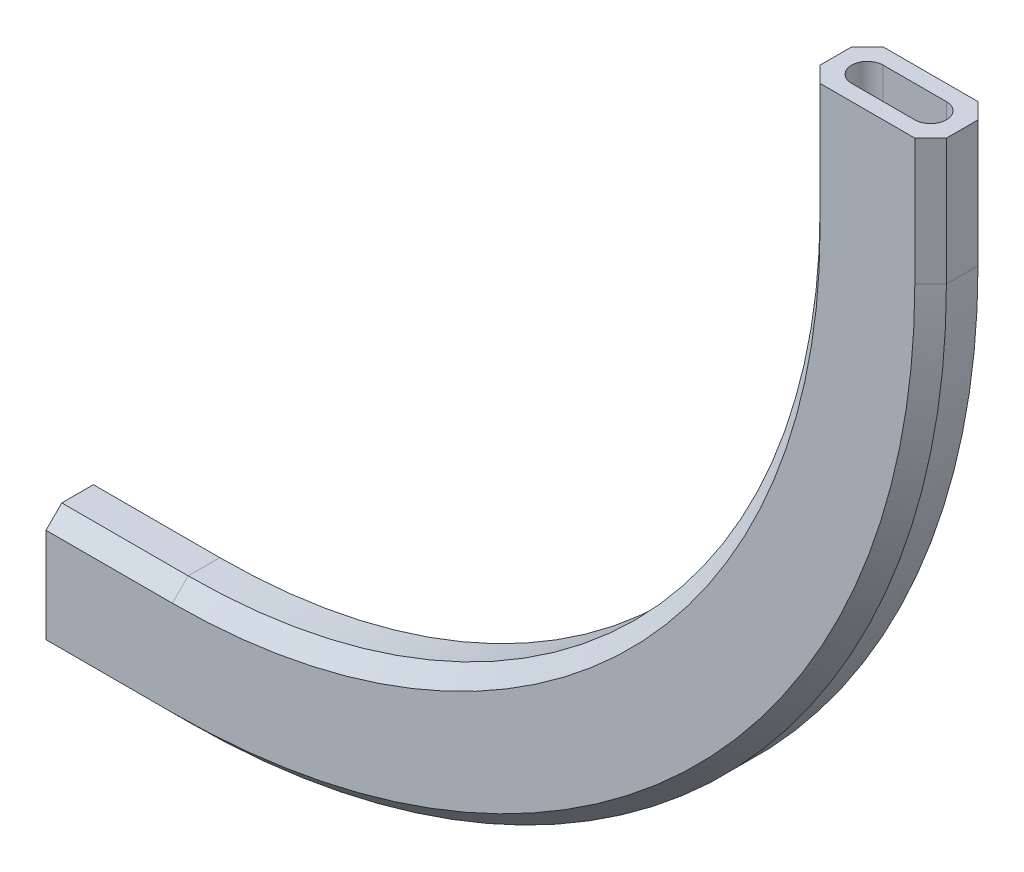
ISO-10303-21;
HEADER;
FILE_DESCRIPTION(('STEP AP214'),'2;1');
FILE_NAME('part.step','',(''),(''),'','','');
FILE_SCHEMA(('AUTOMOTIVE_DESIGN { 1 0 10303 214 1 1 1 1 }'));
ENDSEC;
DATA;
#1=APPLICATION_CONTEXT('core data for automotive mechanical design processes');
#2=APPLICATION_PROTOCOL_DEFINITION('international standard','automotive_design',2000,#1);
#3=PRODUCT_CONTEXT('',#1,'mechanical');
#4=PRODUCT('Part','Part','',(#3));
#5=PRODUCT_RELATED_PRODUCT_CATEGORY('part','',(#4));
#6=PRODUCT_DEFINITION_FORMATION('','',#4);
#7=PRODUCT_DEFINITION_CONTEXT('part definition',#1,'design');
#8=PRODUCT_DEFINITION('design','',#6,#7);
#9=PRODUCT_DEFINITION_SHAPE('','',#8);
#10=(LENGTH_UNIT() NAMED_UNIT(*) SI_UNIT(.MILLI.,.METRE.));
#11=(NAMED_UNIT(*) PLANE_ANGLE_UNIT() SI_UNIT($,.RADIAN.));
#12=(NAMED_UNIT(*) SI_UNIT($,.STERADIAN.) SOLID_ANGLE_UNIT());
#13=UNCERTAINTY_MEASURE_WITH_UNIT(LENGTH_MEASURE(1.E-05),#10,'distance_accuracy_value','');
#14=(GEOMETRIC_REPRESENTATION_CONTEXT(3) GLOBAL_UNCERTAINTY_ASSIGNED_CONTEXT((#13)) GLOBAL_UNIT_ASSIGNED_CONTEXT((#10,
#11,#12)) REPRESENTATION_CONTEXT('',''));
#15=CARTESIAN_POINT('',(0.,0.,0.));
#16=DIRECTION('',(0.,0.,1.));
#17=DIRECTION('',(1.,0.,0.));
#18=AXIS2_PLACEMENT_3D('',#15,#16,#17);
#19=CARTESIAN_POINT('',(0.,0.,6.35));
#20=DIRECTION('',(1.,0.,0.));
#21=DIRECTION('',(0.,0.,-1.));
#22=AXIS2_PLACEMENT_3D('',#19,#20,#21);
#23=PLANE('',#22);
#24=DIRECTION('',(0.,-1.,0.));
#25=VECTOR('',#24,1.);
#26=CARTESIAN_POINT('',(0.,-3.175,1.5875));
#27=LINE('',#26,#25);
#28=CARTESIAN_POINT('',(0.,-3.175,1.5875));
#29=VERTEX_POINT('',#28);
#30=CARTESIAN_POINT('',(0.,-9.525,1.5875));
#31=VERTEX_POINT('',#30);
#32=EDGE_CURVE('E231',#29,#31,#27,.T.);
#33=ORIENTED_EDGE('',*,*,#32,.F.);
#34=CARTESIAN_POINT('',(0.,-3.175,3.175));
#35=DIRECTION('',(-1.,0.,0.));
#36=DIRECTION('',(0.,0.,1.));
#37=AXIS2_PLACEMENT_3D('',#34,#35,#36);
#38=CIRCLE('',#37,1.5875);
#39=CARTESIAN_POINT('',(0.,-3.175,4.7625));
#40=VERTEX_POINT('',#39);
#41=EDGE_CURVE('E205',#40,#29,#38,.T.);
#42=ORIENTED_EDGE('',*,*,#41,.F.);
#43=DIRECTION('',(0.,1.,0.));
#44=VECTOR('',#43,1.);
#45=CARTESIAN_POINT('',(0.,-3.175,4.7625));
#46=LINE('',#45,#44);
#47=CARTESIAN_POINT('',(0.,-9.525,4.7625));
#48=VERTEX_POINT('',#47);
#49=EDGE_CURVE('E222',#48,#40,#46,.T.);
#50=ORIENTED_EDGE('',*,*,#49,.F.);
#51=CARTESIAN_POINT('',(0.,-9.525,3.175));
#52=DIRECTION('',(-1.,0.,0.));
#53=DIRECTION('',(0.,0.,1.));
#54=AXIS2_PLACEMENT_3D('',#51,#52,#53);
#55=CIRCLE('',#54,1.5875);
#56=EDGE_CURVE('E225',#31,#48,#55,.T.);
#57=ORIENTED_EDGE('',*,*,#56,.F.);
#58=EDGE_LOOP('',(#33,#42,#50,#57));
#59=FACE_BOUND('',#58,.T.);
#60=DIRECTION('',(0.,-1.,0.));
#61=VECTOR('',#60,1.);
#62=CARTESIAN_POINT('',(0.,0.,0.));
#63=LINE('',#62,#61);
#64=CARTESIAN_POINT('',(0.,-1.58749999999999,0.));
#65=VERTEX_POINT('',#64);
#66=CARTESIAN_POINT('',(0.,-11.1125,0.));
#67=VERTEX_POINT('',#66);
#68=EDGE_CURVE('E267',#65,#67,#63,.T.);
#69=ORIENTED_EDGE('',*,*,#68,.T.);
#70=DIRECTION('',(0.,-0.707106781186547,0.707106781186548));
#71=VECTOR('',#70,1.);
#72=CARTESIAN_POINT('',(0.,-12.7,1.58749999999998));
#73=LINE('',#72,#71);
#74=CARTESIAN_POINT('',(0.,-12.7,1.58749999999998));
#75=VERTEX_POINT('',#74);
#76=EDGE_CURVE('E330',#67,#75,#73,.T.);
#77=ORIENTED_EDGE('',*,*,#76,.T.);
#78=DIRECTION('',(0.,0.,-1.));
#79=VECTOR('',#78,1.);
#80=CARTESIAN_POINT('',(0.,-12.7,6.35));
#81=LINE('',#80,#79);
#82=CARTESIAN_POINT('',(0.,-12.7,4.76250000000001));
#83=VERTEX_POINT('',#82);
#84=EDGE_CURVE('E304',#83,#75,#81,.T.);
#85=ORIENTED_EDGE('',*,*,#84,.F.);
#86=DIRECTION('',(0.,-0.707106781186547,-0.707106781186548));
#87=VECTOR('',#86,1.);
#88=CARTESIAN_POINT('',(0.,-11.1125,6.35));
#89=LINE('',#88,#87);
#90=CARTESIAN_POINT('',(0.,-11.1125,6.35));
#91=VERTEX_POINT('',#90);
#92=EDGE_CURVE('E328',#83,#91,#89,.F.);
#93=ORIENTED_EDGE('',*,*,#92,.T.);
#94=DIRECTION('',(0.,-1.,0.));
#95=VECTOR('',#94,1.);
#96=CARTESIAN_POINT('',(0.,0.,6.35));
#97=LINE('',#96,#95);
#98=CARTESIAN_POINT('',(0.,-1.58750000000001,6.35));
#99=VERTEX_POINT('',#98);
#100=EDGE_CURVE('E274',#99,#91,#97,.T.);
#101=ORIENTED_EDGE('',*,*,#100,.F.);
#102=DIRECTION('',(0.,-0.707106781186551,0.707106781186544));
#103=VECTOR('',#102,1.);
#104=CARTESIAN_POINT('',(0.,-1.58750000000001,6.35));
#105=LINE('',#104,#103);
#106=CARTESIAN_POINT('',(0.,0.,4.76250000000001));
#107=VERTEX_POINT('',#106);
#108=EDGE_CURVE('E324',#99,#107,#105,.F.);
#109=ORIENTED_EDGE('',*,*,#108,.T.);
#110=DIRECTION('',(0.,0.,-1.));
#111=VECTOR('',#110,1.);
#112=CARTESIAN_POINT('',(0.,0.,6.35));
#113=LINE('',#112,#111);
#114=CARTESIAN_POINT('',(0.,0.,1.58749999999998));
#115=VERTEX_POINT('',#114);
#116=EDGE_CURVE('E281',#107,#115,#113,.T.);
#117=ORIENTED_EDGE('',*,*,#116,.T.);
#118=DIRECTION('',(0.,-0.707106781186551,-0.707106781186544));
#119=VECTOR('',#118,1.);
#120=CARTESIAN_POINT('',(0.,0.,1.58749999999998));
#121=LINE('',#120,#119);
#122=EDGE_CURVE('E326',#115,#65,#121,.T.);
#123=ORIENTED_EDGE('',*,*,#122,.T.);
#124=EDGE_LOOP('',(#69,#77,#85,#93,#101,#109,#117,#123));
#125=FACE_BOUND('',#124,.T.);
#126=ADVANCED_FACE('F35',(#59,#125),#23,.F.);
#127=CARTESIAN_POINT('',(0.,-12.7,6.35));
#128=DIRECTION('',(0.,1.,0.));
#129=DIRECTION('',(0.,0.,1.));
#130=AXIS2_PLACEMENT_3D('',#127,#128,#129);
#131=PLANE('',#130);
#132=ORIENTED_EDGE('',*,*,#84,.T.);
#133=DIRECTION('',(1.,0.,0.));
#134=VECTOR('',#133,1.);
#135=CARTESIAN_POINT('',(12.7,-12.7,1.58749999999998));
#136=LINE('',#135,#134);
#137=CARTESIAN_POINT('',(12.7,-12.7,1.58749999999998));
#138=VERTEX_POINT('',#137);
#139=EDGE_CURVE('E309',#75,#138,#136,.T.);
#140=ORIENTED_EDGE('',*,*,#139,.T.);
#141=DIRECTION('',(0.,0.,-1.));
#142=VECTOR('',#141,1.);
#143=CARTESIAN_POINT('',(12.7,-12.7,6.35));
#144=LINE('',#143,#142);
#145=CARTESIAN_POINT('',(12.7,-12.7,4.76250000000001));
#146=VERTEX_POINT('',#145);
#147=EDGE_CURVE('E301',#146,#138,#144,.T.);
#148=ORIENTED_EDGE('',*,*,#147,.F.);
#149=DIRECTION('',(-1.,0.,0.));
#150=VECTOR('',#149,1.);
#151=CARTESIAN_POINT('',(0.,-12.7,4.76250000000001));
#152=LINE('',#151,#150);
#153=EDGE_CURVE('E307',#146,#83,#152,.T.);
#154=ORIENTED_EDGE('',*,*,#153,.T.);
#155=EDGE_LOOP('',(#132,#140,#148,#154));
#156=FACE_BOUND('',#155,.T.);
#157=ADVANCED_FACE('F425',(#156),#131,.F.);
#158=CARTESIAN_POINT('',(12.7,63.5,6.35));
#159=DIRECTION('',(0.,0.,-1.));
#160=DIRECTION('',(-1.,0.,0.));
#161=AXIS2_PLACEMENT_3D('',#158,#159,#160);
#162=CYLINDRICAL_SURFACE('',#161,76.2);
#163=ORIENTED_EDGE('',*,*,#147,.T.);
#164=CARTESIAN_POINT('',(12.7,63.5,1.58749999999998));
#165=DIRECTION('',(0.,0.,-1.));
#166=DIRECTION('',(-1.,0.,0.));
#167=AXIS2_PLACEMENT_3D('',#164,#165,#166);
#168=CIRCLE('',#167,76.2);
#169=CARTESIAN_POINT('',(88.9,63.5,1.58749999999998));
#170=VERTEX_POINT('',#169);
#171=EDGE_CURVE('E346',#138,#170,#168,.F.);
#172=ORIENTED_EDGE('',*,*,#171,.T.);
#173=DIRECTION('',(0.,0.,-1.));
#174=VECTOR('',#173,1.);
#175=CARTESIAN_POINT('',(88.9,63.5,6.35));
#176=LINE('',#175,#174);
#177=CARTESIAN_POINT('',(88.9,63.5,4.76250000000001));
#178=VERTEX_POINT('',#177);
#179=EDGE_CURVE('E298',#178,#170,#176,.T.);
#180=ORIENTED_EDGE('',*,*,#179,.F.);
#181=CARTESIAN_POINT('',(12.7,63.5,4.76250000000001));
#182=DIRECTION('',(0.,0.,-1.));
#183=DIRECTION('',(-1.,0.,0.));
#184=AXIS2_PLACEMENT_3D('',#181,#182,#183);
#185=CIRCLE('',#184,76.2);
#186=EDGE_CURVE('E344',#178,#146,#185,.T.);
#187=ORIENTED_EDGE('',*,*,#186,.T.);
#188=EDGE_LOOP('',(#163,#172,#180,#187));
#189=FACE_BOUND('',#188,.T.);
#190=ADVANCED_FACE('F423',(#189),#162,.T.);
#191=CARTESIAN_POINT('',(88.9,63.5,6.35));
#192=DIRECTION('',(-1.,0.,0.));
#193=DIRECTION('',(0.,0.,1.));
#194=AXIS2_PLACEMENT_3D('',#191,#192,#193);
#195=PLANE('',#194);
#196=ORIENTED_EDGE('',*,*,#179,.T.);
#197=DIRECTION('',(0.,1.,0.));
#198=VECTOR('',#197,1.);
#199=CARTESIAN_POINT('',(88.9,76.2,1.58749999999998));
#200=LINE('',#199,#198);
#201=CARTESIAN_POINT('',(88.9,76.2,1.58749999999998));
#202=VERTEX_POINT('',#201);
#203=EDGE_CURVE('E334',#170,#202,#200,.T.);
#204=ORIENTED_EDGE('',*,*,#203,.T.);
#205=DIRECTION('',(0.,0.,-1.));
#206=VECTOR('',#205,1.);
#207=CARTESIAN_POINT('',(88.9,76.2,6.35));
#208=LINE('',#207,#206);
#209=CARTESIAN_POINT('',(88.9,76.2,4.76250000000001));
#210=VERTEX_POINT('',#209);
#211=EDGE_CURVE('E295',#210,#202,#208,.T.);
#212=ORIENTED_EDGE('',*,*,#211,.F.);
#213=DIRECTION('',(0.,-1.,0.));
#214=VECTOR('',#213,1.);
#215=CARTESIAN_POINT('',(88.9,63.5,4.76250000000001));
#216=LINE('',#215,#214);
#217=EDGE_CURVE('E332',#210,#178,#216,.T.);
#218=ORIENTED_EDGE('',*,*,#217,.T.);
#219=EDGE_LOOP('',(#196,#204,#212,#218));
#220=FACE_BOUND('',#219,.T.);
#221=ADVANCED_FACE('F439',(#220),#195,.F.);
#222=CARTESIAN_POINT('',(76.2,76.2,6.35));
#223=DIRECTION('',(0.,-1.,0.));
#224=DIRECTION('',(0.,0.,-1.));
#225=AXIS2_PLACEMENT_3D('',#222,#223,#224);
#226=PLANE('',#225);
#227=DIRECTION('',(1.,0.,0.));
#228=VECTOR('',#227,1.);
#229=CARTESIAN_POINT('',(79.375,76.2,4.7625));
#230=LINE('',#229,#228);
#231=CARTESIAN_POINT('',(79.375,76.2,4.7625));
#232=VERTEX_POINT('',#231);
#233=CARTESIAN_POINT('',(85.725,76.2,4.7625));
#234=VERTEX_POINT('',#233);
#235=EDGE_CURVE('E257',#232,#234,#230,.T.);
#236=ORIENTED_EDGE('',*,*,#235,.F.);
#237=CARTESIAN_POINT('',(79.375,76.2,3.175));
#238=DIRECTION('',(0.,1.,0.));
#239=DIRECTION('',(0.,0.,1.));
#240=AXIS2_PLACEMENT_3D('',#237,#238,#239);
#241=CIRCLE('',#240,1.5875);
#242=CARTESIAN_POINT('',(79.375,76.2,1.5875));
#243=VERTEX_POINT('',#242);
#244=EDGE_CURVE('E238',#243,#232,#241,.T.);
#245=ORIENTED_EDGE('',*,*,#244,.F.);
#246=DIRECTION('',(-1.,0.,0.));
#247=VECTOR('',#246,1.);
#248=CARTESIAN_POINT('',(79.375,76.2,1.5875));
#249=LINE('',#248,#247);
#250=CARTESIAN_POINT('',(85.725,76.2,1.5875));
#251=VERTEX_POINT('',#250);
#252=EDGE_CURVE('E246',#251,#243,#249,.T.);
#253=ORIENTED_EDGE('',*,*,#252,.F.);
#254=CARTESIAN_POINT('',(85.725,76.2,3.175));
#255=DIRECTION('',(0.,1.,0.));
#256=DIRECTION('',(0.,0.,1.));
#257=AXIS2_PLACEMENT_3D('',#254,#255,#256);
#258=CIRCLE('',#257,1.5875);
#259=EDGE_CURVE('E260',#234,#251,#258,.T.);
#260=ORIENTED_EDGE('',*,*,#259,.F.);
#261=EDGE_LOOP('',(#236,#245,#253,#260));
#262=FACE_BOUND('',#261,.T.);
#263=ORIENTED_EDGE('',*,*,#211,.T.);
#264=DIRECTION('',(-0.707106781186548,0.,-0.707106781186548));
#265=VECTOR('',#264,1.);
#266=CARTESIAN_POINT('',(88.9,76.2,1.58749999999998));
#267=LINE('',#266,#265);
#268=CARTESIAN_POINT('',(87.3125,76.2,0.));
#269=VERTEX_POINT('',#268);
#270=EDGE_CURVE('E342',#202,#269,#267,.T.);
#271=ORIENTED_EDGE('',*,*,#270,.T.);
#272=DIRECTION('',(-1.,0.,0.));
#273=VECTOR('',#272,1.);
#274=CARTESIAN_POINT('',(76.2,76.2,0.));
#275=LINE('',#274,#273);
#276=CARTESIAN_POINT('',(77.7875,76.2,0.));
#277=VERTEX_POINT('',#276);
#278=EDGE_CURVE('E278',#269,#277,#275,.T.);
#279=ORIENTED_EDGE('',*,*,#278,.T.);
#280=DIRECTION('',(-0.707106781186551,0.,0.707106781186544));
#281=VECTOR('',#280,1.);
#282=CARTESIAN_POINT('',(76.2,76.2,1.58749999999997));
#283=LINE('',#282,#281);
#284=CARTESIAN_POINT('',(76.2,76.2,1.58749999999999));
#285=VERTEX_POINT('',#284);
#286=EDGE_CURVE('E338',#277,#285,#283,.T.);
#287=ORIENTED_EDGE('',*,*,#286,.T.);
#288=DIRECTION('',(0.,0.,-1.));
#289=VECTOR('',#288,1.);
#290=CARTESIAN_POINT('',(76.2,76.2,6.35));
#291=LINE('',#290,#289);
#292=CARTESIAN_POINT('',(76.2,76.2,4.7625));
#293=VERTEX_POINT('',#292);
#294=EDGE_CURVE('E292',#293,#285,#291,.T.);
#295=ORIENTED_EDGE('',*,*,#294,.F.);
#296=DIRECTION('',(-0.707106781186551,0.,-0.707106781186544));
#297=VECTOR('',#296,1.);
#298=CARTESIAN_POINT('',(77.7875,76.2,6.35000000000001));
#299=LINE('',#298,#297);
#300=CARTESIAN_POINT('',(77.7875,76.2,6.35));
#301=VERTEX_POINT('',#300);
#302=EDGE_CURVE('E336',#293,#301,#299,.F.);
#303=ORIENTED_EDGE('',*,*,#302,.T.);
#304=DIRECTION('',(-1.,0.,0.));
#305=VECTOR('',#304,1.);
#306=CARTESIAN_POINT('',(76.2,76.2,6.35));
#307=LINE('',#306,#305);
#308=CARTESIAN_POINT('',(87.3125,76.2,6.35));
#309=VERTEX_POINT('',#308);
#310=EDGE_CURVE('E277',#309,#301,#307,.T.);
#311=ORIENTED_EDGE('',*,*,#310,.F.);
#312=DIRECTION('',(-0.707106781186548,0.,0.707106781186548));
#313=VECTOR('',#312,1.);
#314=CARTESIAN_POINT('',(87.3125,76.2,6.35));
#315=LINE('',#314,#313);
#316=EDGE_CURVE('E340',#309,#210,#315,.F.);
#317=ORIENTED_EDGE('',*,*,#316,.T.);
#318=EDGE_LOOP('',(#263,#271,#279,#287,#295,#303,#311,#317));
#319=FACE_BOUND('',#318,.T.);
#320=ADVANCED_FACE('F447',(#262,#319),#226,.F.);
#321=CARTESIAN_POINT('',(76.2,63.5,6.35));
#322=DIRECTION('',(1.,0.,0.));
#323=DIRECTION('',(0.,1.,0.));
#324=AXIS2_PLACEMENT_3D('',#321,#322,#323);
#325=PLANE('',#324);
#326=ORIENTED_EDGE('',*,*,#294,.T.);
#327=DIRECTION('',(0.,-1.,0.));
#328=VECTOR('',#327,1.);
#329=CARTESIAN_POINT('',(76.2,63.5,1.58749999999998));
#330=LINE('',#329,#328);
#331=CARTESIAN_POINT('',(76.2,63.5,1.58749999999998));
#332=VERTEX_POINT('',#331);
#333=EDGE_CURVE('E364',#285,#332,#330,.T.);
#334=ORIENTED_EDGE('',*,*,#333,.T.);
#335=DIRECTION('',(0.,0.,-1.));
#336=VECTOR('',#335,1.);
#337=CARTESIAN_POINT('',(76.2,63.5,6.35));
#338=LINE('',#337,#336);
#339=CARTESIAN_POINT('',(76.2,63.5,4.76250000000001));
#340=VERTEX_POINT('',#339);
#341=EDGE_CURVE('E290',#340,#332,#338,.T.);
#342=ORIENTED_EDGE('',*,*,#341,.F.);
#343=DIRECTION('',(0.,1.,0.));
#344=VECTOR('',#343,1.);
#345=CARTESIAN_POINT('',(76.2,63.5,4.76250000000001));
#346=LINE('',#345,#344);
#347=EDGE_CURVE('E362',#340,#293,#346,.T.);
#348=ORIENTED_EDGE('',*,*,#347,.T.);
#349=EDGE_LOOP('',(#326,#334,#342,#348));
#350=FACE_BOUND('',#349,.T.);
#351=ADVANCED_FACE('F462',(#350),#325,.F.);
#352=CARTESIAN_POINT('',(12.7,63.5,6.35));
#353=DIRECTION('',(0.,0.,-1.));
#354=DIRECTION('',(-1.,0.,0.));
#355=AXIS2_PLACEMENT_3D('',#352,#353,#354);
#356=CYLINDRICAL_SURFACE('',#355,63.5);
#357=ORIENTED_EDGE('',*,*,#341,.T.);
#358=CARTESIAN_POINT('',(12.7,63.5,1.58749999999998));
#359=DIRECTION('',(0.,0.,-1.));
#360=DIRECTION('',(-1.,0.,0.));
#361=AXIS2_PLACEMENT_3D('',#358,#359,#360);
#362=CIRCLE('',#361,63.5);
#363=CARTESIAN_POINT('',(12.7,0.,1.58749999999998));
#364=VERTEX_POINT('',#363);
#365=EDGE_CURVE('E11',#332,#364,#362,.T.);
#366=ORIENTED_EDGE('',*,*,#365,.T.);
#367=DIRECTION('',(0.,0.,-1.));
#368=VECTOR('',#367,1.);
#369=CARTESIAN_POINT('',(12.7,0.,6.35));
#370=LINE('',#369,#368);
#371=CARTESIAN_POINT('',(12.7,0.,4.76250000000001));
#372=VERTEX_POINT('',#371);
#373=EDGE_CURVE('E288',#372,#364,#370,.T.);
#374=ORIENTED_EDGE('',*,*,#373,.F.);
#375=CARTESIAN_POINT('',(12.7,63.5,4.76250000000001));
#376=DIRECTION('',(0.,0.,-1.));
#377=DIRECTION('',(-1.,0.,0.));
#378=AXIS2_PLACEMENT_3D('',#375,#376,#377);
#379=CIRCLE('',#378,63.5);
#380=EDGE_CURVE('E44',#372,#340,#379,.F.);
#381=ORIENTED_EDGE('',*,*,#380,.T.);
#382=EDGE_LOOP('',(#357,#366,#374,#381));
#383=FACE_BOUND('',#382,.T.);
#384=ADVANCED_FACE('F464',(#383),#356,.F.);
#385=CARTESIAN_POINT('',(0.,0.,6.35));
#386=DIRECTION('',(0.,-1.,0.));
#387=DIRECTION('',(0.,0.,-1.));
#388=AXIS2_PLACEMENT_3D('',#385,#386,#387);
#389=PLANE('',#388);
#390=ORIENTED_EDGE('',*,*,#373,.T.);
#391=DIRECTION('',(-1.,0.,0.));
#392=VECTOR('',#391,1.);
#393=CARTESIAN_POINT('',(0.,0.,1.58749999999998));
#394=LINE('',#393,#392);
#395=EDGE_CURVE('E368',#364,#115,#394,.T.);
#396=ORIENTED_EDGE('',*,*,#395,.T.);
#397=ORIENTED_EDGE('',*,*,#116,.F.);
#398=DIRECTION('',(1.,0.,0.));
#399=VECTOR('',#398,1.);
#400=CARTESIAN_POINT('',(0.,0.,4.76250000000001));
#401=LINE('',#400,#399);
#402=EDGE_CURVE('E57',#107,#372,#401,.T.);
#403=ORIENTED_EDGE('',*,*,#402,.T.);
#404=EDGE_LOOP('',(#390,#396,#397,#403));
#405=FACE_BOUND('',#404,.T.);
#406=ADVANCED_FACE('F466',(#405),#389,.F.);
#407=CARTESIAN_POINT('',(12.7,63.5,6.35));
#408=DIRECTION('',(0.,0.,-1.));
#409=DIRECTION('',(-1.,0.,0.));
#410=AXIS2_PLACEMENT_3D('',#407,#408,#409);
#411=PLANE('',#410);
#412=ORIENTED_EDGE('',*,*,#100,.T.);
#413=DIRECTION('',(1.,0.,0.));
#414=VECTOR('',#413,1.);
#415=CARTESIAN_POINT('',(12.7,-11.1125,6.35));
#416=LINE('',#415,#414);
#417=CARTESIAN_POINT('',(12.7,-11.1125,6.35));
#418=VERTEX_POINT('',#417);
#419=EDGE_CURVE('E359',#91,#418,#416,.T.);
#420=ORIENTED_EDGE('',*,*,#419,.T.);
#421=CARTESIAN_POINT('',(12.7,63.5,6.35));
#422=DIRECTION('',(0.,0.,-1.));
#423=DIRECTION('',(-1.,0.,0.));
#424=AXIS2_PLACEMENT_3D('',#421,#422,#423);
#425=CIRCLE('',#424,74.6125);
#426=CARTESIAN_POINT('',(87.3125,63.5,6.35));
#427=VERTEX_POINT('',#426);
#428=EDGE_CURVE('E355',#418,#427,#425,.F.);
#429=ORIENTED_EDGE('',*,*,#428,.T.);
#430=DIRECTION('',(0.,1.,0.));
#431=VECTOR('',#430,1.);
#432=CARTESIAN_POINT('',(87.3125,63.5,6.35));
#433=LINE('',#432,#431);
#434=EDGE_CURVE('E357',#427,#309,#433,.T.);
#435=ORIENTED_EDGE('',*,*,#434,.T.);
#436=ORIENTED_EDGE('',*,*,#310,.T.);
#437=DIRECTION('',(0.,-1.,0.));
#438=VECTOR('',#437,1.);
#439=CARTESIAN_POINT('',(77.7875,63.5000000000001,6.35));
#440=LINE('',#439,#438);
#441=CARTESIAN_POINT('',(77.7875,63.5,6.35));
#442=VERTEX_POINT('',#441);
#443=EDGE_CURVE('E352',#301,#442,#440,.T.);
#444=ORIENTED_EDGE('',*,*,#443,.T.);
#445=CARTESIAN_POINT('',(12.7,63.5,6.35));
#446=DIRECTION('',(0.,0.,-1.));
#447=DIRECTION('',(-1.,0.,0.));
#448=AXIS2_PLACEMENT_3D('',#445,#446,#447);
#449=CIRCLE('',#448,65.0875);
#450=CARTESIAN_POINT('',(12.7,-1.58750000000001,6.35));
#451=VERTEX_POINT('',#450);
#452=EDGE_CURVE('E348',#442,#451,#449,.T.);
#453=ORIENTED_EDGE('',*,*,#452,.T.);
#454=DIRECTION('',(-1.,0.,0.));
#455=VECTOR('',#454,1.);
#456=CARTESIAN_POINT('',(12.7,-1.58750000000001,6.35));
#457=LINE('',#456,#455);
#458=EDGE_CURVE('E350',#451,#99,#457,.T.);
#459=ORIENTED_EDGE('',*,*,#458,.T.);
#460=EDGE_LOOP('',(#412,#420,#429,#435,#436,#444,#453,#459));
#461=FACE_BOUND('',#460,.T.);
#462=ADVANCED_FACE('F400',(#461),#411,.F.);
#463=CARTESIAN_POINT('',(12.7,63.5,0.));
#464=DIRECTION('',(0.,0.,-1.));
#465=DIRECTION('',(-1.,0.,0.));
#466=AXIS2_PLACEMENT_3D('',#463,#464,#465);
#467=PLANE('',#466);
#468=CARTESIAN_POINT('',(12.7,63.5,0.));
#469=DIRECTION('',(0.,0.,-1.));
#470=DIRECTION('',(-1.,0.,0.));
#471=AXIS2_PLACEMENT_3D('',#468,#469,#470);
#472=CIRCLE('',#471,74.6125);
#473=CARTESIAN_POINT('',(87.3125,63.5,0.));
#474=VERTEX_POINT('',#473);
#475=CARTESIAN_POINT('',(12.7,-11.1125,0.));
#476=VERTEX_POINT('',#475);
#477=EDGE_CURVE('E318',#474,#476,#472,.T.);
#478=ORIENTED_EDGE('',*,*,#477,.T.);
#479=DIRECTION('',(-1.,0.,0.));
#480=VECTOR('',#479,1.);
#481=CARTESIAN_POINT('',(0.,-11.1125,0.));
#482=LINE('',#481,#480);
#483=EDGE_CURVE('E322',#476,#67,#482,.T.);
#484=ORIENTED_EDGE('',*,*,#483,.T.);
#485=ORIENTED_EDGE('',*,*,#68,.F.);
#486=DIRECTION('',(1.,0.,0.));
#487=VECTOR('',#486,1.);
#488=CARTESIAN_POINT('',(12.7,-1.58749999999999,0.));
#489=LINE('',#488,#487);
#490=CARTESIAN_POINT('',(12.7,-1.58749999999999,0.));
#491=VERTEX_POINT('',#490);
#492=EDGE_CURVE('E314',#65,#491,#489,.T.);
#493=ORIENTED_EDGE('',*,*,#492,.T.);
#494=CARTESIAN_POINT('',(12.7,63.5,0.));
#495=DIRECTION('',(0.,0.,-1.));
#496=DIRECTION('',(-1.,0.,0.));
#497=AXIS2_PLACEMENT_3D('',#494,#495,#496);
#498=CIRCLE('',#497,65.0875);
#499=CARTESIAN_POINT('',(77.7875,63.5,0.));
#500=VERTEX_POINT('',#499);
#501=EDGE_CURVE('E312',#491,#500,#498,.F.);
#502=ORIENTED_EDGE('',*,*,#501,.T.);
#503=DIRECTION('',(0.,1.,0.));
#504=VECTOR('',#503,1.);
#505=CARTESIAN_POINT('',(77.7875,76.2,0.));
#506=LINE('',#505,#504);
#507=EDGE_CURVE('E316',#500,#277,#506,.T.);
#508=ORIENTED_EDGE('',*,*,#507,.T.);
#509=ORIENTED_EDGE('',*,*,#278,.F.);
#510=DIRECTION('',(0.,-1.,0.));
#511=VECTOR('',#510,1.);
#512=CARTESIAN_POINT('',(87.3125,63.5,0.));
#513=LINE('',#512,#511);
#514=EDGE_CURVE('E320',#269,#474,#513,.T.);
#515=ORIENTED_EDGE('',*,*,#514,.T.);
#516=EDGE_LOOP('',(#478,#484,#485,#493,#502,#508,#509,#515));
#517=FACE_BOUND('',#516,.T.);
#518=ADVANCED_FACE('F450',(#517),#467,.T.);
#519=CARTESIAN_POINT('',(79.375,63.5,3.175));
#520=DIRECTION('',(0.,1.,0.));
#521=DIRECTION('',(0.,0.,1.));
#522=AXIS2_PLACEMENT_3D('',#519,#520,#521);
#523=CYLINDRICAL_SURFACE('',#522,1.5875);
#524=ORIENTED_EDGE('',*,*,#244,.T.);
#525=DIRECTION('',(0.,1.,0.));
#526=VECTOR('',#525,1.);
#527=CARTESIAN_POINT('',(79.375,63.5,4.7625));
#528=LINE('',#527,#526);
#529=CARTESIAN_POINT('',(79.375,63.5,4.7625));
#530=VERTEX_POINT('',#529);
#531=EDGE_CURVE('E255',#530,#232,#528,.T.);
#532=ORIENTED_EDGE('',*,*,#531,.F.);
#533=CARTESIAN_POINT('',(79.375,63.5,3.175));
#534=DIRECTION('',(0.,1.,0.));
#535=DIRECTION('',(0.,0.,1.));
#536=AXIS2_PLACEMENT_3D('',#533,#534,#535);
#537=CIRCLE('',#536,1.5875);
#538=CARTESIAN_POINT('',(79.375,63.5,1.5875));
#539=VERTEX_POINT('',#538);
#540=EDGE_CURVE('E242',#539,#530,#537,.T.);
#541=ORIENTED_EDGE('',*,*,#540,.F.);
#542=DIRECTION('',(0.,1.,0.));
#543=VECTOR('',#542,1.);
#544=CARTESIAN_POINT('',(79.375,63.5,1.5875));
#545=LINE('',#544,#543);
#546=EDGE_CURVE('E265',#539,#243,#545,.T.);
#547=ORIENTED_EDGE('',*,*,#546,.T.);
#548=EDGE_LOOP('',(#524,#532,#541,#547));
#549=FACE_BOUND('',#548,.T.);
#550=ADVANCED_FACE('F583',(#549),#523,.F.);
#551=CARTESIAN_POINT('',(79.375,63.5,1.5875));
#552=DIRECTION('',(0.,0.,-1.));
#553=DIRECTION('',(-1.,0.,0.));
#554=AXIS2_PLACEMENT_3D('',#551,#552,#553);
#555=PLANE('',#554);
#556=ORIENTED_EDGE('',*,*,#252,.T.);
#557=ORIENTED_EDGE('',*,*,#546,.F.);
#558=DIRECTION('',(-1.,0.,0.));
#559=VECTOR('',#558,1.);
#560=CARTESIAN_POINT('',(79.375,63.5,1.5875));
#561=LINE('',#560,#559);
#562=CARTESIAN_POINT('',(85.725,63.5,1.5875));
#563=VERTEX_POINT('',#562);
#564=EDGE_CURVE('E252',#563,#539,#561,.T.);
#565=ORIENTED_EDGE('',*,*,#564,.F.);
#566=DIRECTION('',(0.,1.,0.));
#567=VECTOR('',#566,1.);
#568=CARTESIAN_POINT('',(85.725,63.5,1.5875));
#569=LINE('',#568,#567);
#570=EDGE_CURVE('E268',#563,#251,#569,.T.);
#571=ORIENTED_EDGE('',*,*,#570,.T.);
#572=EDGE_LOOP('',(#556,#557,#565,#571));
#573=FACE_BOUND('',#572,.T.);
#574=ADVANCED_FACE('F723',(#573),#555,.F.);
#575=CARTESIAN_POINT('',(85.725,63.5,3.175));
#576=DIRECTION('',(0.,1.,0.));
#577=DIRECTION('',(0.,0.,1.));
#578=AXIS2_PLACEMENT_3D('',#575,#576,#577);
#579=CYLINDRICAL_SURFACE('',#578,1.5875);
#580=ORIENTED_EDGE('',*,*,#259,.T.);
#581=ORIENTED_EDGE('',*,*,#570,.F.);
#582=CARTESIAN_POINT('',(85.725,63.5,3.175));
#583=DIRECTION('',(0.,1.,0.));
#584=DIRECTION('',(0.,0.,1.));
#585=AXIS2_PLACEMENT_3D('',#582,#583,#584);
#586=CIRCLE('',#585,1.5875);
#587=CARTESIAN_POINT('',(85.725,63.5,4.7625));
#588=VERTEX_POINT('',#587);
#589=EDGE_CURVE('E249',#588,#563,#586,.T.);
#590=ORIENTED_EDGE('',*,*,#589,.F.);
#591=DIRECTION('',(0.,1.,0.));
#592=VECTOR('',#591,1.);
#593=CARTESIAN_POINT('',(85.725,63.5,4.7625));
#594=LINE('',#593,#592);
#595=EDGE_CURVE('E270',#588,#234,#594,.T.);
#596=ORIENTED_EDGE('',*,*,#595,.T.);
#597=EDGE_LOOP('',(#580,#581,#590,#596));
#598=FACE_BOUND('',#597,.T.);
#599=ADVANCED_FACE('F713',(#598),#579,.F.);
#600=CARTESIAN_POINT('',(79.375,63.5,4.7625));
#601=DIRECTION('',(0.,0.,1.));
#602=DIRECTION('',(1.,0.,0.));
#603=AXIS2_PLACEMENT_3D('',#600,#601,#602);
#604=PLANE('',#603);
#605=ORIENTED_EDGE('',*,*,#235,.T.);
#606=ORIENTED_EDGE('',*,*,#595,.F.);
#607=DIRECTION('',(1.,0.,0.));
#608=VECTOR('',#607,1.);
#609=CARTESIAN_POINT('',(79.375,63.5,4.7625));
#610=LINE('',#609,#608);
#611=EDGE_CURVE('E245',#530,#588,#610,.T.);
#612=ORIENTED_EDGE('',*,*,#611,.F.);
#613=ORIENTED_EDGE('',*,*,#531,.T.);
#614=EDGE_LOOP('',(#605,#606,#612,#613));
#615=FACE_BOUND('',#614,.T.);
#616=ADVANCED_FACE('F703',(#615),#604,.F.);
#617=CARTESIAN_POINT('',(79.375,63.5,3.175));
#618=DIRECTION('',(0.,1.,0.));
#619=DIRECTION('',(0.,0.,1.));
#620=AXIS2_PLACEMENT_3D('',#617,#618,#619);
#621=PLANE('',#620);
#622=ORIENTED_EDGE('',*,*,#540,.T.);
#623=ORIENTED_EDGE('',*,*,#611,.T.);
#624=ORIENTED_EDGE('',*,*,#589,.T.);
#625=ORIENTED_EDGE('',*,*,#564,.T.);
#626=EDGE_LOOP('',(#622,#623,#624,#625));
#627=FACE_BOUND('',#626,.T.);
#628=ADVANCED_FACE('F694',(#627),#621,.T.);
#629=CARTESIAN_POINT('',(12.7,-3.175,3.175));
#630=DIRECTION('',(-1.,0.,0.));
#631=DIRECTION('',(0.,0.,1.));
#632=AXIS2_PLACEMENT_3D('',#629,#630,#631);
#633=CYLINDRICAL_SURFACE('',#632,1.5875);
#634=ORIENTED_EDGE('',*,*,#41,.T.);
#635=DIRECTION('',(-1.,0.,0.));
#636=VECTOR('',#635,1.);
#637=CARTESIAN_POINT('',(12.7,-3.175,1.5875));
#638=LINE('',#637,#636);
#639=CARTESIAN_POINT('',(12.7,-3.175,1.5875));
#640=VERTEX_POINT('',#639);
#641=EDGE_CURVE('E198',#640,#29,#638,.T.);
#642=ORIENTED_EDGE('',*,*,#641,.F.);
#643=CARTESIAN_POINT('',(12.7,-3.175,3.175));
#644=DIRECTION('',(-1.,0.,0.));
#645=DIRECTION('',(0.,0.,1.));
#646=AXIS2_PLACEMENT_3D('',#643,#644,#645);
#647=CIRCLE('',#646,1.5875);
#648=CARTESIAN_POINT('',(12.7,-3.175,4.7625));
#649=VERTEX_POINT('',#648);
#650=EDGE_CURVE('E202',#649,#640,#647,.T.);
#651=ORIENTED_EDGE('',*,*,#650,.F.);
#652=DIRECTION('',(-1.,0.,0.));
#653=VECTOR('',#652,1.);
#654=CARTESIAN_POINT('',(12.7,-3.175,4.7625));
#655=LINE('',#654,#653);
#656=EDGE_CURVE('E236',#649,#40,#655,.T.);
#657=ORIENTED_EDGE('',*,*,#656,.T.);
#658=EDGE_LOOP('',(#634,#642,#651,#657));
#659=FACE_BOUND('',#658,.T.);
#660=ADVANCED_FACE('F200',(#659),#633,.F.);
#661=CARTESIAN_POINT('',(12.7,-3.175,4.7625));
#662=DIRECTION('',(0.,0.,1.));
#663=DIRECTION('',(0.,-1.,0.));
#664=AXIS2_PLACEMENT_3D('',#661,#662,#663);
#665=PLANE('',#664);
#666=ORIENTED_EDGE('',*,*,#49,.T.);
#667=ORIENTED_EDGE('',*,*,#656,.F.);
#668=DIRECTION('',(0.,1.,0.));
#669=VECTOR('',#668,1.);
#670=CARTESIAN_POINT('',(12.7,-3.175,4.7625));
#671=LINE('',#670,#669);
#672=CARTESIAN_POINT('',(12.7,-9.525,4.7625));
#673=VERTEX_POINT('',#672);
#674=EDGE_CURVE('E210',#673,#649,#671,.T.);
#675=ORIENTED_EDGE('',*,*,#674,.F.);
#676=DIRECTION('',(-1.,0.,0.));
#677=VECTOR('',#676,1.);
#678=CARTESIAN_POINT('',(12.7,-9.525,4.7625));
#679=LINE('',#678,#677);
#680=EDGE_CURVE('E239',#673,#48,#679,.T.);
#681=ORIENTED_EDGE('',*,*,#680,.T.);
#682=EDGE_LOOP('',(#666,#667,#675,#681));
#683=FACE_BOUND('',#682,.T.);
#684=ADVANCED_FACE('F675',(#683),#665,.F.);
#685=CARTESIAN_POINT('',(12.7,-9.525,3.175));
#686=DIRECTION('',(-1.,0.,0.));
#687=DIRECTION('',(0.,0.,1.));
#688=AXIS2_PLACEMENT_3D('',#685,#686,#687);
#689=CYLINDRICAL_SURFACE('',#688,1.5875);
#690=ORIENTED_EDGE('',*,*,#56,.T.);
#691=ORIENTED_EDGE('',*,*,#680,.F.);
#692=CARTESIAN_POINT('',(12.7,-9.525,3.175));
#693=DIRECTION('',(-1.,0.,0.));
#694=DIRECTION('',(0.,0.,1.));
#695=AXIS2_PLACEMENT_3D('',#692,#693,#694);
#696=CIRCLE('',#695,1.5875);
#697=CARTESIAN_POINT('',(12.7,-9.525,1.5875));
#698=VERTEX_POINT('',#697);
#699=EDGE_CURVE('E218',#698,#673,#696,.T.);
#700=ORIENTED_EDGE('',*,*,#699,.F.);
#701=DIRECTION('',(-1.,0.,0.));
#702=VECTOR('',#701,1.);
#703=CARTESIAN_POINT('',(12.7,-9.525,1.5875));
#704=LINE('',#703,#702);
#705=EDGE_CURVE('E209',#698,#31,#704,.T.);
#706=ORIENTED_EDGE('',*,*,#705,.T.);
#707=EDGE_LOOP('',(#690,#691,#700,#706));
#708=FACE_BOUND('',#707,.T.);
#709=ADVANCED_FACE('F666',(#708),#689,.F.);
#710=CARTESIAN_POINT('',(12.7,-3.175,1.5875));
#711=DIRECTION('',(0.,0.,-1.));
#712=DIRECTION('',(0.,1.,0.));
#713=AXIS2_PLACEMENT_3D('',#710,#711,#712);
#714=PLANE('',#713);
#715=ORIENTED_EDGE('',*,*,#32,.T.);
#716=ORIENTED_EDGE('',*,*,#705,.F.);
#717=DIRECTION('',(0.,-1.,0.));
#718=VECTOR('',#717,1.);
#719=CARTESIAN_POINT('',(12.7,-3.175,1.5875));
#720=LINE('',#719,#718);
#721=EDGE_CURVE('E213',#640,#698,#720,.T.);
#722=ORIENTED_EDGE('',*,*,#721,.F.);
#723=ORIENTED_EDGE('',*,*,#641,.T.);
#724=EDGE_LOOP('',(#715,#716,#722,#723));
#725=FACE_BOUND('',#724,.T.);
#726=ADVANCED_FACE('F214',(#725),#714,.F.);
#727=CARTESIAN_POINT('',(12.7,-3.175,3.175));
#728=DIRECTION('',(-1.,0.,0.));
#729=DIRECTION('',(0.,0.,1.));
#730=AXIS2_PLACEMENT_3D('',#727,#728,#729);
#731=PLANE('',#730);
#732=ORIENTED_EDGE('',*,*,#650,.T.);
#733=ORIENTED_EDGE('',*,*,#721,.T.);
#734=ORIENTED_EDGE('',*,*,#699,.T.);
#735=ORIENTED_EDGE('',*,*,#674,.T.);
#736=EDGE_LOOP('',(#732,#733,#734,#735));
#737=FACE_BOUND('',#736,.T.);
#738=ADVANCED_FACE('F220',(#737),#731,.T.);
#739=CARTESIAN_POINT('',(88.9,63.5,1.58749999999998));
#740=DIRECTION('',(0.707106781186547,0.,-0.707106781186547));
#741=DIRECTION('',(0.,-1.,0.));
#742=AXIS2_PLACEMENT_3D('',#739,#740,#741);
#743=PLANE('',#742);
#744=ORIENTED_EDGE('',*,*,#270,.F.);
#745=ORIENTED_EDGE('',*,*,#203,.F.);
#746=DIRECTION('',(0.707106781186547,0.,0.707106781186547));
#747=VECTOR('',#746,1.);
#748=CARTESIAN_POINT('',(87.3125,63.5,0.));
#749=LINE('',#748,#747);
#750=EDGE_CURVE('E232',#474,#170,#749,.T.);
#751=ORIENTED_EDGE('',*,*,#750,.F.);
#752=ORIENTED_EDGE('',*,*,#514,.F.);
#753=EDGE_LOOP('',(#744,#745,#751,#752));
#754=FACE_BOUND('',#753,.T.);
#755=ADVANCED_FACE('F443',(#754),#743,.T.);
#756=CARTESIAN_POINT('',(12.7,63.5,1.58749999999998));
#757=DIRECTION('',(0.,0.,1.));
#758=DIRECTION('',(1.,0.,0.));
#759=AXIS2_PLACEMENT_3D('',#756,#757,#758);
#760=CONICAL_SURFACE('',#759,76.2,0.785398163397448);
#761=ORIENTED_EDGE('',*,*,#750,.T.);
#762=ORIENTED_EDGE('',*,*,#171,.F.);
#763=DIRECTION('',(0.,-0.707106781186547,0.707106781186548));
#764=VECTOR('',#763,1.);
#765=CARTESIAN_POINT('',(12.7,-11.1125,0.));
#766=LINE('',#765,#764);
#767=EDGE_CURVE('E371',#476,#138,#766,.T.);
#768=ORIENTED_EDGE('',*,*,#767,.F.);
#769=ORIENTED_EDGE('',*,*,#477,.F.);
#770=EDGE_LOOP('',(#761,#762,#768,#769));
#771=FACE_BOUND('',#770,.T.);
#772=ADVANCED_FACE('F435',(#771),#760,.T.);
#773=CARTESIAN_POINT('',(0.,-12.7,1.58749999999998));
#774=DIRECTION('',(0.,-0.707106781186548,-0.707106781186547));
#775=DIRECTION('',(-1.,0.,0.));
#776=AXIS2_PLACEMENT_3D('',#773,#774,#775);
#777=PLANE('',#776);
#778=ORIENTED_EDGE('',*,*,#76,.F.);
#779=ORIENTED_EDGE('',*,*,#483,.F.);
#780=ORIENTED_EDGE('',*,*,#767,.T.);
#781=ORIENTED_EDGE('',*,*,#139,.F.);
#782=EDGE_LOOP('',(#778,#779,#780,#781));
#783=FACE_BOUND('',#782,.T.);
#784=ADVANCED_FACE('F429',(#783),#777,.T.);
#785=CARTESIAN_POINT('',(87.3125,63.5,6.35));
#786=DIRECTION('',(-0.707106781186548,0.,-0.707106781186548));
#787=DIRECTION('',(0.,1.,0.));
#788=AXIS2_PLACEMENT_3D('',#785,#786,#787);
#789=PLANE('',#788);
#790=ORIENTED_EDGE('',*,*,#316,.F.);
#791=ORIENTED_EDGE('',*,*,#434,.F.);
#792=DIRECTION('',(-0.707106781186548,0.,0.707106781186548));
#793=VECTOR('',#792,1.);
#794=CARTESIAN_POINT('',(88.9,63.5,4.76250000000001));
#795=LINE('',#794,#793);
#796=EDGE_CURVE('E373',#178,#427,#795,.T.);
#797=ORIENTED_EDGE('',*,*,#796,.F.);
#798=ORIENTED_EDGE('',*,*,#217,.F.);
#799=EDGE_LOOP('',(#790,#791,#797,#798));
#800=FACE_BOUND('',#799,.T.);
#801=ADVANCED_FACE('F416',(#800),#789,.F.);
#802=CARTESIAN_POINT('',(12.7,63.5,6.35));
#803=DIRECTION('',(0.,0.,-1.));
#804=DIRECTION('',(-1.,0.,0.));
#805=AXIS2_PLACEMENT_3D('',#802,#803,#804);
#806=CONICAL_SURFACE('',#805,74.6125,0.785398163397448);
#807=ORIENTED_EDGE('',*,*,#796,.T.);
#808=ORIENTED_EDGE('',*,*,#428,.F.);
#809=DIRECTION('',(0.,0.707106781186547,0.707106781186548));
#810=VECTOR('',#809,1.);
#811=CARTESIAN_POINT('',(12.7,-12.7,4.76250000000001));
#812=LINE('',#811,#810);
#813=EDGE_CURVE('E376',#146,#418,#812,.T.);
#814=ORIENTED_EDGE('',*,*,#813,.F.);
#815=ORIENTED_EDGE('',*,*,#186,.F.);
#816=EDGE_LOOP('',(#807,#808,#814,#815));
#817=FACE_BOUND('',#816,.T.);
#818=ADVANCED_FACE('F419',(#817),#806,.T.);
#819=CARTESIAN_POINT('',(12.7,-11.1125,6.35));
#820=DIRECTION('',(0.,0.707106781186548,-0.707106781186547));
#821=DIRECTION('',(1.,0.,0.));
#822=AXIS2_PLACEMENT_3D('',#819,#820,#821);
#823=PLANE('',#822);
#824=ORIENTED_EDGE('',*,*,#92,.F.);
#825=ORIENTED_EDGE('',*,*,#153,.F.);
#826=ORIENTED_EDGE('',*,*,#813,.T.);
#827=ORIENTED_EDGE('',*,*,#419,.F.);
#828=EDGE_LOOP('',(#824,#825,#826,#827));
#829=FACE_BOUND('',#828,.T.);
#830=ADVANCED_FACE('F407',(#829),#823,.F.);
#831=CARTESIAN_POINT('',(0.,0.,1.58749999999998));
#832=DIRECTION('',(0.,0.707106781186544,-0.707106781186551));
#833=DIRECTION('',(1.,0.,0.));
#834=AXIS2_PLACEMENT_3D('',#831,#832,#833);
#835=PLANE('',#834);
#836=ORIENTED_EDGE('',*,*,#122,.F.);
#837=ORIENTED_EDGE('',*,*,#395,.F.);
#838=DIRECTION('',(0.,0.707106781186551,0.707106781186544));
#839=VECTOR('',#838,1.);
#840=CARTESIAN_POINT('',(12.7,-1.58749999999999,0.));
#841=LINE('',#840,#839);
#842=EDGE_CURVE('E378',#491,#364,#841,.T.);
#843=ORIENTED_EDGE('',*,*,#842,.F.);
#844=ORIENTED_EDGE('',*,*,#492,.F.);
#845=EDGE_LOOP('',(#836,#837,#843,#844));
#846=FACE_BOUND('',#845,.T.);
#847=ADVANCED_FACE('F469',(#846),#835,.T.);
#848=CARTESIAN_POINT('',(12.7,63.5,1.58749999999998));
#849=DIRECTION('',(0.,0.,-1.));
#850=DIRECTION('',(-1.,0.,0.));
#851=AXIS2_PLACEMENT_3D('',#848,#849,#850);
#852=CONICAL_SURFACE('',#851,63.5,0.785398163397453);
#853=ORIENTED_EDGE('',*,*,#842,.T.);
#854=ORIENTED_EDGE('',*,*,#365,.F.);
#855=DIRECTION('',(-0.707106781186551,0.,0.707106781186544));
#856=VECTOR('',#855,1.);
#857=CARTESIAN_POINT('',(77.7875,63.5,0.));
#858=LINE('',#857,#856);
#859=EDGE_CURVE('E381',#500,#332,#858,.T.);
#860=ORIENTED_EDGE('',*,*,#859,.F.);
#861=ORIENTED_EDGE('',*,*,#501,.F.);
#862=EDGE_LOOP('',(#853,#854,#860,#861));
#863=FACE_BOUND('',#862,.T.);
#864=ADVANCED_FACE('F458',(#863),#852,.F.);
#865=CARTESIAN_POINT('',(76.2,63.5,1.58749999999998));
#866=DIRECTION('',(-0.707106781186544,0.,-0.707106781186551));
#867=DIRECTION('',(0.,1.,0.));
#868=AXIS2_PLACEMENT_3D('',#865,#866,#867);
#869=PLANE('',#868);
#870=ORIENTED_EDGE('',*,*,#286,.F.);
#871=ORIENTED_EDGE('',*,*,#507,.F.);
#872=ORIENTED_EDGE('',*,*,#859,.T.);
#873=ORIENTED_EDGE('',*,*,#333,.F.);
#874=EDGE_LOOP('',(#870,#871,#872,#873));
#875=FACE_BOUND('',#874,.T.);
#876=ADVANCED_FACE('F455',(#875),#869,.T.);
#877=CARTESIAN_POINT('',(12.7,-1.58750000000001,6.35));
#878=DIRECTION('',(0.,-0.707106781186544,-0.707106781186551));
#879=DIRECTION('',(-1.,0.,0.));
#880=AXIS2_PLACEMENT_3D('',#877,#878,#879);
#881=PLANE('',#880);
#882=ORIENTED_EDGE('',*,*,#108,.F.);
#883=ORIENTED_EDGE('',*,*,#458,.F.);
#884=DIRECTION('',(0.,-0.707106781186551,0.707106781186544));
#885=VECTOR('',#884,1.);
#886=CARTESIAN_POINT('',(12.7,0.,4.76250000000001));
#887=LINE('',#886,#885);
#888=EDGE_CURVE('E39',#372,#451,#887,.T.);
#889=ORIENTED_EDGE('',*,*,#888,.F.);
#890=ORIENTED_EDGE('',*,*,#402,.F.);
#891=EDGE_LOOP('',(#882,#883,#889,#890));
#892=FACE_BOUND('',#891,.T.);
#893=ADVANCED_FACE('F37',(#892),#881,.F.);
#894=CARTESIAN_POINT('',(12.7,63.5,6.35));
#895=DIRECTION('',(0.,0.,1.));
#896=DIRECTION('',(1.,0.,0.));
#897=AXIS2_PLACEMENT_3D('',#894,#895,#896);
#898=CONICAL_SURFACE('',#897,65.0875,0.785398163397453);
#899=ORIENTED_EDGE('',*,*,#888,.T.);
#900=ORIENTED_EDGE('',*,*,#452,.F.);
#901=DIRECTION('',(0.707106781186551,0.,0.707106781186544));
#902=VECTOR('',#901,1.);
#903=CARTESIAN_POINT('',(76.2,63.5,4.76250000000001));
#904=LINE('',#903,#902);
#905=EDGE_CURVE('E384',#340,#442,#904,.T.);
#906=ORIENTED_EDGE('',*,*,#905,.F.);
#907=ORIENTED_EDGE('',*,*,#380,.F.);
#908=EDGE_LOOP('',(#899,#900,#906,#907));
#909=FACE_BOUND('',#908,.T.);
#910=ADVANCED_FACE('F394',(#909),#898,.F.);
#911=CARTESIAN_POINT('',(77.7875,63.5000000000001,6.35));
#912=DIRECTION('',(0.707106781186544,0.,-0.707106781186551));
#913=DIRECTION('',(0.,-1.,0.));
#914=AXIS2_PLACEMENT_3D('',#911,#912,#913);
#915=PLANE('',#914);
#916=ORIENTED_EDGE('',*,*,#302,.F.);
#917=ORIENTED_EDGE('',*,*,#347,.F.);
#918=ORIENTED_EDGE('',*,*,#905,.T.);
#919=ORIENTED_EDGE('',*,*,#443,.F.);
#920=EDGE_LOOP('',(#916,#917,#918,#919));
#921=FACE_BOUND('',#920,.T.);
#922=ADVANCED_FACE('F507',(#921),#915,.F.);
#923=CLOSED_SHELL('',(#126,#157,#190,#221,#320,#351,#384,#406,#462,#518,#550,#574,#599,#616,
#628,#660,#684,#709,#726,#738,#755,#772,#784,#801,#818,#830,#847,#864,#876,#893,#910,#922));
#924=MANIFOLD_SOLID_BREP('B2',#923);
#925=ADVANCED_BREP_SHAPE_REPRESENTATION('',(#18,#924),#14);
#926=SHAPE_DEFINITION_REPRESENTATION(#9,#925);
ENDSEC;
END-ISO-10303-21;
